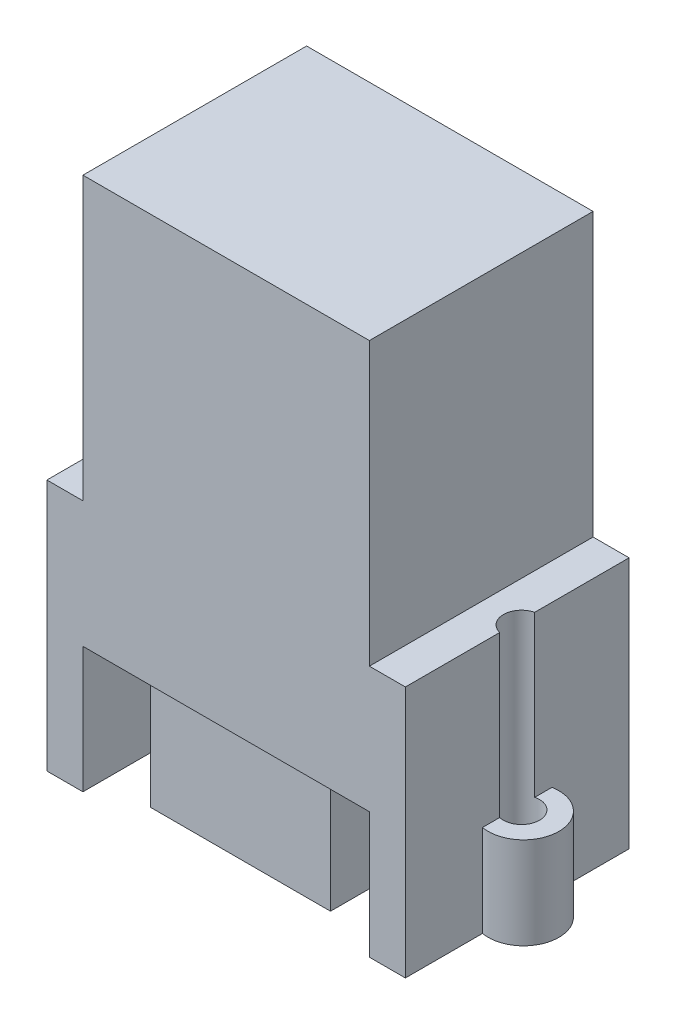
ISO-10303-21;
HEADER;
FILE_DESCRIPTION(('STEP AP214'),'2;1');
FILE_NAME('part.step','',(''),(''),'','','');
FILE_SCHEMA(('AUTOMOTIVE_DESIGN { 1 0 10303 214 1 1 1 1 }'));
ENDSEC;
DATA;
#1=APPLICATION_CONTEXT('core data for automotive mechanical design processes');
#2=APPLICATION_PROTOCOL_DEFINITION('international standard','automotive_design',2000,#1);
#3=PRODUCT_CONTEXT('',#1,'mechanical');
#4=PRODUCT('Part','Part','',(#3));
#5=PRODUCT_RELATED_PRODUCT_CATEGORY('part','',(#4));
#6=PRODUCT_DEFINITION_FORMATION('','',#4);
#7=PRODUCT_DEFINITION_CONTEXT('part definition',#1,'design');
#8=PRODUCT_DEFINITION('design','',#6,#7);
#9=PRODUCT_DEFINITION_SHAPE('','',#8);
#10=(LENGTH_UNIT() NAMED_UNIT(*) SI_UNIT(.MILLI.,.METRE.));
#11=(NAMED_UNIT(*) PLANE_ANGLE_UNIT() SI_UNIT($,.RADIAN.));
#12=(NAMED_UNIT(*) SI_UNIT($,.STERADIAN.) SOLID_ANGLE_UNIT());
#13=UNCERTAINTY_MEASURE_WITH_UNIT(LENGTH_MEASURE(1.E-05),#10,'distance_accuracy_value','');
#14=(GEOMETRIC_REPRESENTATION_CONTEXT(3) GLOBAL_UNCERTAINTY_ASSIGNED_CONTEXT((#13)) GLOBAL_UNIT_ASSIGNED_CONTEXT((#10,
#11,#12)) REPRESENTATION_CONTEXT('',''));
#15=CARTESIAN_POINT('',(0.,0.,0.));
#16=DIRECTION('',(0.,0.,1.));
#17=DIRECTION('',(1.,0.,0.));
#18=AXIS2_PLACEMENT_3D('',#15,#16,#17);
#19=CARTESIAN_POINT('',(14.935,0.,0.));
#20=DIRECTION('',(1.,0.,0.));
#21=DIRECTION('',(0.,0.,1.));
#22=AXIS2_PLACEMENT_3D('',#19,#20,#21);
#23=PLANE('',#22);
#24=DIRECTION('',(0.,0.,-1.));
#25=VECTOR('',#24,1.);
#26=CARTESIAN_POINT('',(14.935,-2.85126793820283,0.));
#27=LINE('',#26,#25);
#28=CARTESIAN_POINT('',(14.935,-2.85126793820283,2.89448350417906));
#29=VERTEX_POINT('',#28);
#30=CARTESIAN_POINT('',(14.935,-2.85126793820283,1.45738635920609));
#31=VERTEX_POINT('',#30);
#32=EDGE_CURVE('E261',#29,#31,#27,.T.);
#33=ORIENTED_EDGE('',*,*,#32,.T.);
#34=DIRECTION('',(0.,-1.,0.));
#35=VECTOR('',#34,1.);
#36=CARTESIAN_POINT('',(14.935,34.,1.45738635920609));
#37=LINE('',#36,#35);
#38=CARTESIAN_POINT('',(14.935,10.5012679382028,1.45738635920609));
#39=VERTEX_POINT('',#38);
#40=EDGE_CURVE('E48',#31,#39,#37,.F.);
#41=ORIENTED_EDGE('',*,*,#40,.T.);
#42=DIRECTION('',(0.,0.,-1.));
#43=VECTOR('',#42,1.);
#44=CARTESIAN_POINT('',(14.935,10.5012679382028,-9.32));
#45=LINE('',#44,#43);
#46=CARTESIAN_POINT('',(14.935,10.5012679382028,9.32));
#47=VERTEX_POINT('',#46);
#48=EDGE_CURVE('E287',#47,#39,#45,.T.);
#49=ORIENTED_EDGE('',*,*,#48,.F.);
#50=DIRECTION('',(0.,1.,0.));
#51=VECTOR('',#50,1.);
#52=CARTESIAN_POINT('',(14.935,10.5012679382028,9.32));
#53=LINE('',#52,#51);
#54=CARTESIAN_POINT('',(14.935,-10.5012679382028,9.32));
#55=VERTEX_POINT('',#54);
#56=EDGE_CURVE('E276',#55,#47,#53,.T.);
#57=ORIENTED_EDGE('',*,*,#56,.F.);
#58=DIRECTION('',(0.,0.,1.));
#59=VECTOR('',#58,1.);
#60=CARTESIAN_POINT('',(14.935,-10.5012679382028,-9.32));
#61=LINE('',#60,#59);
#62=CARTESIAN_POINT('',(14.935,-10.5012679382028,2.89448350417906));
#63=VERTEX_POINT('',#62);
#64=EDGE_CURVE('E279',#63,#55,#61,.T.);
#65=ORIENTED_EDGE('',*,*,#64,.F.);
#66=DIRECTION('',(0.,-1.,0.));
#67=VECTOR('',#66,1.);
#68=CARTESIAN_POINT('',(14.935,-2.85126793820283,2.89448350417906));
#69=LINE('',#68,#67);
#70=EDGE_CURVE('E271',#29,#63,#69,.T.);
#71=ORIENTED_EDGE('',*,*,#70,.F.);
#72=EDGE_LOOP('',(#33,#41,#49,#57,#65,#71));
#73=FACE_BOUND('',#72,.T.);
#74=ADVANCED_FACE('F34',(#73),#23,.T.);
#75=CARTESIAN_POINT('',(14.935,10.5012679382028,-1.45738635920609));
#76=VERTEX_POINT('',#75);
#77=CARTESIAN_POINT('',(14.935,10.5012679382028,-9.32));
#78=VERTEX_POINT('',#77);
#79=EDGE_CURVE('E255',#76,#78,#45,.T.);
#80=ORIENTED_EDGE('',*,*,#79,.F.);
#81=DIRECTION('',(0.,-1.,0.));
#82=VECTOR('',#81,1.);
#83=CARTESIAN_POINT('',(14.935,34.,-1.45738635920609));
#84=LINE('',#83,#82);
#85=CARTESIAN_POINT('',(14.935,-2.85126793820283,-1.45738635920609));
#86=VERTEX_POINT('',#85);
#87=EDGE_CURVE('E242',#76,#86,#84,.T.);
#88=ORIENTED_EDGE('',*,*,#87,.T.);
#89=CARTESIAN_POINT('',(14.935,-2.85126793820283,-2.89448350417906));
#90=VERTEX_POINT('',#89);
#91=EDGE_CURVE('E252',#86,#90,#27,.T.);
#92=ORIENTED_EDGE('',*,*,#91,.T.);
#93=DIRECTION('',(0.,-1.,0.));
#94=VECTOR('',#93,1.);
#95=CARTESIAN_POINT('',(14.935,-2.85126793820283,-2.89448350417906));
#96=LINE('',#95,#94);
#97=CARTESIAN_POINT('',(14.935,-10.5012679382028,-2.89448350417906));
#98=VERTEX_POINT('',#97);
#99=EDGE_CURVE('E269',#90,#98,#96,.T.);
#100=ORIENTED_EDGE('',*,*,#99,.T.);
#101=CARTESIAN_POINT('',(14.935,-10.5012679382028,-9.32));
#102=VERTEX_POINT('',#101);
#103=EDGE_CURVE('E281',#102,#98,#61,.T.);
#104=ORIENTED_EDGE('',*,*,#103,.F.);
#105=DIRECTION('',(0.,-1.,0.));
#106=VECTOR('',#105,1.);
#107=CARTESIAN_POINT('',(14.935,10.5012679382028,-9.32));
#108=LINE('',#107,#106);
#109=EDGE_CURVE('E284',#78,#102,#108,.T.);
#110=ORIENTED_EDGE('',*,*,#109,.F.);
#111=EDGE_LOOP('',(#80,#88,#92,#100,#104,#110));
#112=FACE_BOUND('',#111,.T.);
#113=ADVANCED_FACE('F250',(#112),#23,.T.);
#114=CARTESIAN_POINT('',(-14.935,0.,0.));
#115=DIRECTION('',(-1.,0.,0.));
#116=DIRECTION('',(0.,0.,1.));
#117=AXIS2_PLACEMENT_3D('',#114,#115,#116);
#118=PLANE('',#117);
#119=DIRECTION('',(0.,-1.,0.));
#120=VECTOR('',#119,1.);
#121=CARTESIAN_POINT('',(-14.935,34.,-1.45738635920609));
#122=LINE('',#121,#120);
#123=CARTESIAN_POINT('',(-14.935,10.5012679382028,-1.45738635920609));
#124=VERTEX_POINT('',#123);
#125=CARTESIAN_POINT('',(-14.935,-2.85126793820283,-1.45738635920609));
#126=VERTEX_POINT('',#125);
#127=EDGE_CURVE('E56',#124,#126,#122,.T.);
#128=ORIENTED_EDGE('',*,*,#127,.F.);
#129=DIRECTION('',(0.,0.,-1.));
#130=VECTOR('',#129,1.);
#131=CARTESIAN_POINT('',(-14.935,10.5012679382028,-9.32));
#132=LINE('',#131,#130);
#133=CARTESIAN_POINT('',(-14.935,10.5012679382028,-9.32));
#134=VERTEX_POINT('',#133);
#135=EDGE_CURVE('E327',#124,#134,#132,.T.);
#136=ORIENTED_EDGE('',*,*,#135,.T.);
#137=DIRECTION('',(0.,-1.,0.));
#138=VECTOR('',#137,1.);
#139=CARTESIAN_POINT('',(-14.935,10.5012679382028,-9.32));
#140=LINE('',#139,#138);
#141=CARTESIAN_POINT('',(-14.935,-10.5012679382028,-9.32));
#142=VERTEX_POINT('',#141);
#143=EDGE_CURVE('E332',#134,#142,#140,.T.);
#144=ORIENTED_EDGE('',*,*,#143,.T.);
#145=DIRECTION('',(0.,0.,1.));
#146=VECTOR('',#145,1.);
#147=CARTESIAN_POINT('',(-14.935,-10.5012679382028,-9.32));
#148=LINE('',#147,#146);
#149=CARTESIAN_POINT('',(-14.935,-10.5012679382028,-2.89448350417906));
#150=VERTEX_POINT('',#149);
#151=EDGE_CURVE('E335',#142,#150,#148,.T.);
#152=ORIENTED_EDGE('',*,*,#151,.T.);
#153=DIRECTION('',(0.,-1.,0.));
#154=VECTOR('',#153,1.);
#155=CARTESIAN_POINT('',(-14.935,-2.85126793820283,-2.89448350417906));
#156=LINE('',#155,#154);
#157=CARTESIAN_POINT('',(-14.935,-2.85126793820283,-2.89448350417906));
#158=VERTEX_POINT('',#157);
#159=EDGE_CURVE('E318',#158,#150,#156,.T.);
#160=ORIENTED_EDGE('',*,*,#159,.F.);
#161=DIRECTION('',(0.,0.,-1.));
#162=VECTOR('',#161,1.);
#163=CARTESIAN_POINT('',(-14.935,-2.85126793820283,0.));
#164=LINE('',#163,#162);
#165=EDGE_CURVE('E312',#126,#158,#164,.T.);
#166=ORIENTED_EDGE('',*,*,#165,.F.);
#167=EDGE_LOOP('',(#128,#136,#144,#152,#160,#166));
#168=FACE_BOUND('',#167,.T.);
#169=ADVANCED_FACE('F498',(#168),#118,.T.);
#170=CARTESIAN_POINT('',(-11.935,34.,9.32));
#171=DIRECTION('',(1.,0.,0.));
#172=DIRECTION('',(0.,0.,-1.));
#173=AXIS2_PLACEMENT_3D('',#170,#171,#172);
#174=PLANE('',#173);
#175=DIRECTION('',(0.,0.,-1.));
#176=VECTOR('',#175,1.);
#177=CARTESIAN_POINT('',(-11.935,10.5012679382028,-9.32));
#178=LINE('',#177,#176);
#179=CARTESIAN_POINT('',(-11.935,10.5012679382028,9.32));
#180=VERTEX_POINT('',#179);
#181=CARTESIAN_POINT('',(-11.935,10.5012679382028,-9.32));
#182=VERTEX_POINT('',#181);
#183=EDGE_CURVE('E340',#180,#182,#178,.T.);
#184=ORIENTED_EDGE('',*,*,#183,.F.);
#185=DIRECTION('',(0.,-1.,0.));
#186=VECTOR('',#185,1.);
#187=CARTESIAN_POINT('',(-11.935,34.,9.32));
#188=LINE('',#187,#186);
#189=CARTESIAN_POINT('',(-11.935,34.,9.32));
#190=VERTEX_POINT('',#189);
#191=EDGE_CURVE('E379',#190,#180,#188,.T.);
#192=ORIENTED_EDGE('',*,*,#191,.F.);
#193=DIRECTION('',(0.,0.,1.));
#194=VECTOR('',#193,1.);
#195=CARTESIAN_POINT('',(-11.935,34.,9.32));
#196=LINE('',#195,#194);
#197=CARTESIAN_POINT('',(-11.935,34.,-9.32));
#198=VERTEX_POINT('',#197);
#199=EDGE_CURVE('E364',#198,#190,#196,.T.);
#200=ORIENTED_EDGE('',*,*,#199,.F.);
#201=DIRECTION('',(0.,-1.,0.));
#202=VECTOR('',#201,1.);
#203=CARTESIAN_POINT('',(-11.935,34.,-9.32));
#204=LINE('',#203,#202);
#205=EDGE_CURVE('E382',#198,#182,#204,.T.);
#206=ORIENTED_EDGE('',*,*,#205,.T.);
#207=EDGE_LOOP('',(#184,#192,#200,#206));
#208=FACE_BOUND('',#207,.T.);
#209=ADVANCED_FACE('F585',(#208),#174,.F.);
#210=CARTESIAN_POINT('',(7.5,-10.,8.125));
#211=DIRECTION('',(1.,0.,0.));
#212=DIRECTION('',(0.,0.,-1.));
#213=AXIS2_PLACEMENT_3D('',#210,#211,#212);
#214=PLANE('',#213);
#215=DIRECTION('',(0.,0.,-1.));
#216=VECTOR('',#215,1.);
#217=CARTESIAN_POINT('',(7.5,0.,8.125));
#218=LINE('',#217,#216);
#219=CARTESIAN_POINT('',(7.5,0.,8.125));
#220=VERTEX_POINT('',#219);
#221=CARTESIAN_POINT('',(7.5,0.,-8.125));
#222=VERTEX_POINT('',#221);
#223=EDGE_CURVE('E417',#220,#222,#218,.T.);
#224=ORIENTED_EDGE('',*,*,#223,.F.);
#225=DIRECTION('',(0.,1.,0.));
#226=VECTOR('',#225,1.);
#227=CARTESIAN_POINT('',(7.5,-10.,8.125));
#228=LINE('',#227,#226);
#229=CARTESIAN_POINT('',(7.5,-10.,8.125));
#230=VERTEX_POINT('',#229);
#231=EDGE_CURVE('E484',#230,#220,#228,.T.);
#232=ORIENTED_EDGE('',*,*,#231,.F.);
#233=DIRECTION('',(0.,0.,-1.));
#234=VECTOR('',#233,1.);
#235=CARTESIAN_POINT('',(7.5,-10.,8.125));
#236=LINE('',#235,#234);
#237=CARTESIAN_POINT('',(7.5,-10.,-8.125));
#238=VERTEX_POINT('',#237);
#239=EDGE_CURVE('E460',#230,#238,#236,.T.);
#240=ORIENTED_EDGE('',*,*,#239,.T.);
#241=DIRECTION('',(0.,1.,0.));
#242=VECTOR('',#241,1.);
#243=CARTESIAN_POINT('',(7.5,-10.,-8.125));
#244=LINE('',#243,#242);
#245=EDGE_CURVE('E473',#238,#222,#244,.T.);
#246=ORIENTED_EDGE('',*,*,#245,.T.);
#247=EDGE_LOOP('',(#224,#232,#240,#246));
#248=FACE_BOUND('',#247,.T.);
#249=ADVANCED_FACE('F36',(#248),#214,.T.);
#250=CARTESIAN_POINT('',(-7.5,-10.,8.125));
#251=DIRECTION('',(0.,0.,1.));
#252=DIRECTION('',(1.,0.,0.));
#253=AXIS2_PLACEMENT_3D('',#250,#251,#252);
#254=PLANE('',#253);
#255=DIRECTION('',(1.,0.,0.));
#256=VECTOR('',#255,1.);
#257=CARTESIAN_POINT('',(-7.5,0.,8.125));
#258=LINE('',#257,#256);
#259=CARTESIAN_POINT('',(-7.5,0.,8.125));
#260=VERTEX_POINT('',#259);
#261=EDGE_CURVE('E464',#260,#220,#258,.T.);
#262=ORIENTED_EDGE('',*,*,#261,.F.);
#263=DIRECTION('',(0.,1.,0.));
#264=VECTOR('',#263,1.);
#265=CARTESIAN_POINT('',(-7.5,-10.,8.125));
#266=LINE('',#265,#264);
#267=CARTESIAN_POINT('',(-7.5,-10.,8.125));
#268=VERTEX_POINT('',#267);
#269=EDGE_CURVE('E487',#268,#260,#266,.T.);
#270=ORIENTED_EDGE('',*,*,#269,.F.);
#271=DIRECTION('',(1.,0.,0.));
#272=VECTOR('',#271,1.);
#273=CARTESIAN_POINT('',(-7.5,-10.,8.125));
#274=LINE('',#273,#272);
#275=EDGE_CURVE('E470',#268,#230,#274,.T.);
#276=ORIENTED_EDGE('',*,*,#275,.T.);
#277=ORIENTED_EDGE('',*,*,#231,.T.);
#278=EDGE_LOOP('',(#262,#270,#276,#277));
#279=FACE_BOUND('',#278,.T.);
#280=ADVANCED_FACE('F632',(#279),#254,.T.);
#281=CARTESIAN_POINT('',(-7.5,-10.,8.125));
#282=DIRECTION('',(-1.,0.,0.));
#283=DIRECTION('',(0.,0.,1.));
#284=AXIS2_PLACEMENT_3D('',#281,#282,#283);
#285=PLANE('',#284);
#286=DIRECTION('',(0.,0.,1.));
#287=VECTOR('',#286,1.);
#288=CARTESIAN_POINT('',(-7.5,0.,8.125));
#289=LINE('',#288,#287);
#290=CARTESIAN_POINT('',(-7.5,0.,-8.125));
#291=VERTEX_POINT('',#290);
#292=EDGE_CURVE('E479',#291,#260,#289,.T.);
#293=ORIENTED_EDGE('',*,*,#292,.F.);
#294=DIRECTION('',(0.,1.,0.));
#295=VECTOR('',#294,1.);
#296=CARTESIAN_POINT('',(-7.5,-10.,-8.125));
#297=LINE('',#296,#295);
#298=CARTESIAN_POINT('',(-7.5,-10.,-8.125));
#299=VERTEX_POINT('',#298);
#300=EDGE_CURVE('E489',#299,#291,#297,.T.);
#301=ORIENTED_EDGE('',*,*,#300,.F.);
#302=DIRECTION('',(0.,0.,1.));
#303=VECTOR('',#302,1.);
#304=CARTESIAN_POINT('',(-7.5,-10.,8.125));
#305=LINE('',#304,#303);
#306=EDGE_CURVE('E467',#299,#268,#305,.T.);
#307=ORIENTED_EDGE('',*,*,#306,.T.);
#308=ORIENTED_EDGE('',*,*,#269,.T.);
#309=EDGE_LOOP('',(#293,#301,#307,#308));
#310=FACE_BOUND('',#309,.T.);
#311=ADVANCED_FACE('F635',(#310),#285,.T.);
#312=CARTESIAN_POINT('',(-7.5,-10.,-8.125));
#313=DIRECTION('',(0.,0.,-1.));
#314=DIRECTION('',(-1.,0.,0.));
#315=AXIS2_PLACEMENT_3D('',#312,#313,#314);
#316=PLANE('',#315);
#317=DIRECTION('',(-1.,0.,0.));
#318=VECTOR('',#317,1.);
#319=CARTESIAN_POINT('',(-7.5,0.,-8.125));
#320=LINE('',#319,#318);
#321=EDGE_CURVE('E476',#222,#291,#320,.T.);
#322=ORIENTED_EDGE('',*,*,#321,.F.);
#323=ORIENTED_EDGE('',*,*,#245,.F.);
#324=DIRECTION('',(-1.,0.,0.));
#325=VECTOR('',#324,1.);
#326=CARTESIAN_POINT('',(-7.5,-10.,-8.125));
#327=LINE('',#326,#325);
#328=EDGE_CURVE('E463',#238,#299,#327,.T.);
#329=ORIENTED_EDGE('',*,*,#328,.T.);
#330=ORIENTED_EDGE('',*,*,#300,.T.);
#331=EDGE_LOOP('',(#322,#323,#329,#330));
#332=FACE_BOUND('',#331,.T.);
#333=ADVANCED_FACE('F630',(#332),#316,.T.);
#334=CARTESIAN_POINT('',(0.,-10.,0.));
#335=DIRECTION('',(0.,-1.,0.));
#336=DIRECTION('',(0.,0.,-1.));
#337=AXIS2_PLACEMENT_3D('',#334,#335,#336);
#338=PLANE('',#337);
#339=DIRECTION('',(0.,0.,-1.));
#340=VECTOR('',#339,1.);
#341=CARTESIAN_POINT('',(5.58558044896174,-10.,-3.6946575025496));
#342=LINE('',#341,#340);
#343=CARTESIAN_POINT('',(5.58558044896174,-10.,-3.6946575025496));
#344=VERTEX_POINT('',#343);
#345=CARTESIAN_POINT('',(5.58558044896174,-10.,-7.10244499300927));
#346=VERTEX_POINT('',#345);
#347=EDGE_CURVE('E388',#344,#346,#342,.T.);
#348=ORIENTED_EDGE('',*,*,#347,.T.);
#349=DIRECTION('',(-1.,0.,0.));
#350=VECTOR('',#349,1.);
#351=CARTESIAN_POINT('',(-5.58558044896174,-10.,-7.10244499300927));
#352=LINE('',#351,#350);
#353=CARTESIAN_POINT('',(-5.58558044896174,-10.,-7.10244499300927));
#354=VERTEX_POINT('',#353);
#355=EDGE_CURVE('E391',#346,#354,#352,.T.);
#356=ORIENTED_EDGE('',*,*,#355,.T.);
#357=DIRECTION('',(0.,0.,1.));
#358=VECTOR('',#357,1.);
#359=CARTESIAN_POINT('',(-5.58558044896174,-10.,-3.6946575025496));
#360=LINE('',#359,#358);
#361=CARTESIAN_POINT('',(-5.58558044896174,-10.,-3.6946575025496));
#362=VERTEX_POINT('',#361);
#363=EDGE_CURVE('E395',#354,#362,#360,.T.);
#364=ORIENTED_EDGE('',*,*,#363,.T.);
#365=DIRECTION('',(1.,0.,0.));
#366=VECTOR('',#365,1.);
#367=CARTESIAN_POINT('',(-5.58558044896174,-10.,-3.6946575025496));
#368=LINE('',#367,#366);
#369=EDGE_CURVE('E398',#362,#344,#368,.T.);
#370=ORIENTED_EDGE('',*,*,#369,.T.);
#371=EDGE_LOOP('',(#348,#356,#364,#370));
#372=FACE_BOUND('',#371,.T.);
#373=DIRECTION('',(0.,0.,-1.));
#374=VECTOR('',#373,1.);
#375=CARTESIAN_POINT('',(5.58558044896174,-10.,5.28661924555252));
#376=LINE('',#375,#374);
#377=CARTESIAN_POINT('',(5.58558044896174,-10.,5.28661924555252));
#378=VERTEX_POINT('',#377);
#379=CARTESIAN_POINT('',(5.58558044896174,-10.,1.89696441562148));
#380=VERTEX_POINT('',#379);
#381=EDGE_CURVE('E426',#378,#380,#376,.T.);
#382=ORIENTED_EDGE('',*,*,#381,.T.);
#383=DIRECTION('',(-1.,0.,0.));
#384=VECTOR('',#383,1.);
#385=CARTESIAN_POINT('',(-5.58558044896174,-10.,1.89696441562148));
#386=LINE('',#385,#384);
#387=CARTESIAN_POINT('',(-5.58558044896174,-10.,1.89696441562148));
#388=VERTEX_POINT('',#387);
#389=EDGE_CURVE('E429',#380,#388,#386,.T.);
#390=ORIENTED_EDGE('',*,*,#389,.T.);
#391=DIRECTION('',(0.,0.,1.));
#392=VECTOR('',#391,1.);
#393=CARTESIAN_POINT('',(-5.58558044896174,-10.,5.28661924555252));
#394=LINE('',#393,#392);
#395=CARTESIAN_POINT('',(-5.58558044896174,-10.,5.28661924555252));
#396=VERTEX_POINT('',#395);
#397=EDGE_CURVE('E433',#388,#396,#394,.T.);
#398=ORIENTED_EDGE('',*,*,#397,.T.);
#399=DIRECTION('',(1.,0.,0.));
#400=VECTOR('',#399,1.);
#401=CARTESIAN_POINT('',(-5.58558044896174,-10.,5.28661924555252));
#402=LINE('',#401,#400);
#403=EDGE_CURVE('E436',#396,#378,#402,.T.);
#404=ORIENTED_EDGE('',*,*,#403,.T.);
#405=EDGE_LOOP('',(#382,#390,#398,#404));
#406=FACE_BOUND('',#405,.T.);
#407=ORIENTED_EDGE('',*,*,#239,.F.);
#408=ORIENTED_EDGE('',*,*,#275,.F.);
#409=ORIENTED_EDGE('',*,*,#306,.F.);
#410=ORIENTED_EDGE('',*,*,#328,.F.);
#411=EDGE_LOOP('',(#407,#408,#409,#410));
#412=FACE_BOUND('',#411,.T.);
#413=ADVANCED_FACE('F626',(#372,#406,#412),#338,.T.);
#414=CARTESIAN_POINT('',(5.58558044896174,-10.,5.28661924555252));
#415=DIRECTION('',(1.,0.,0.));
#416=DIRECTION('',(0.,0.,-1.));
#417=AXIS2_PLACEMENT_3D('',#414,#415,#416);
#418=PLANE('',#417);
#419=DIRECTION('',(0.,0.,-1.));
#420=VECTOR('',#419,1.);
#421=CARTESIAN_POINT('',(5.58558044896174,0.,5.28661924555252));
#422=LINE('',#421,#420);
#423=CARTESIAN_POINT('',(5.58558044896174,0.,5.28661924555252));
#424=VERTEX_POINT('',#423);
#425=CARTESIAN_POINT('',(5.58558044896174,0.,1.89696441562148));
#426=VERTEX_POINT('',#425);
#427=EDGE_CURVE('E387',#424,#426,#422,.T.);
#428=ORIENTED_EDGE('',*,*,#427,.T.);
#429=DIRECTION('',(0.,1.,0.));
#430=VECTOR('',#429,1.);
#431=CARTESIAN_POINT('',(5.58558044896174,-10.,1.89696441562148));
#432=LINE('',#431,#430);
#433=EDGE_CURVE('E439',#380,#426,#432,.T.);
#434=ORIENTED_EDGE('',*,*,#433,.F.);
#435=ORIENTED_EDGE('',*,*,#381,.F.);
#436=DIRECTION('',(0.,1.,0.));
#437=VECTOR('',#436,1.);
#438=CARTESIAN_POINT('',(5.58558044896174,-10.,5.28661924555252));
#439=LINE('',#438,#437);
#440=EDGE_CURVE('E406',#378,#424,#439,.T.);
#441=ORIENTED_EDGE('',*,*,#440,.T.);
#442=EDGE_LOOP('',(#428,#434,#435,#441));
#443=FACE_BOUND('',#442,.T.);
#444=ADVANCED_FACE('F616',(#443),#418,.F.);
#445=CARTESIAN_POINT('',(-5.58558044896174,-10.,5.28661924555252));
#446=DIRECTION('',(0.,0.,1.));
#447=DIRECTION('',(1.,0.,0.));
#448=AXIS2_PLACEMENT_3D('',#445,#446,#447);
#449=PLANE('',#448);
#450=DIRECTION('',(1.,0.,0.));
#451=VECTOR('',#450,1.);
#452=CARTESIAN_POINT('',(-5.58558044896174,0.,5.28661924555252));
#453=LINE('',#452,#451);
#454=CARTESIAN_POINT('',(-5.58558044896174,0.,5.28661924555252));
#455=VERTEX_POINT('',#454);
#456=EDGE_CURVE('E430',#455,#424,#453,.T.);
#457=ORIENTED_EDGE('',*,*,#456,.T.);
#458=ORIENTED_EDGE('',*,*,#440,.F.);
#459=ORIENTED_EDGE('',*,*,#403,.F.);
#460=DIRECTION('',(0.,1.,0.));
#461=VECTOR('',#460,1.);
#462=CARTESIAN_POINT('',(-5.58558044896174,-10.,5.28661924555252));
#463=LINE('',#462,#461);
#464=EDGE_CURVE('E452',#396,#455,#463,.T.);
#465=ORIENTED_EDGE('',*,*,#464,.T.);
#466=EDGE_LOOP('',(#457,#458,#459,#465));
#467=FACE_BOUND('',#466,.T.);
#468=ADVANCED_FACE('F612',(#467),#449,.F.);
#469=CARTESIAN_POINT('',(-5.58558044896174,-10.,5.28661924555252));
#470=DIRECTION('',(-1.,0.,0.));
#471=DIRECTION('',(0.,0.,1.));
#472=AXIS2_PLACEMENT_3D('',#469,#470,#471);
#473=PLANE('',#472);
#474=DIRECTION('',(0.,0.,1.));
#475=VECTOR('',#474,1.);
#476=CARTESIAN_POINT('',(-5.58558044896174,0.,5.28661924555252));
#477=LINE('',#476,#475);
#478=CARTESIAN_POINT('',(-5.58558044896174,0.,1.89696441562148));
#479=VERTEX_POINT('',#478);
#480=EDGE_CURVE('E445',#479,#455,#477,.T.);
#481=ORIENTED_EDGE('',*,*,#480,.T.);
#482=ORIENTED_EDGE('',*,*,#464,.F.);
#483=ORIENTED_EDGE('',*,*,#397,.F.);
#484=DIRECTION('',(0.,1.,0.));
#485=VECTOR('',#484,1.);
#486=CARTESIAN_POINT('',(-5.58558044896174,-10.,1.89696441562148));
#487=LINE('',#486,#485);
#488=EDGE_CURVE('E455',#388,#479,#487,.T.);
#489=ORIENTED_EDGE('',*,*,#488,.T.);
#490=EDGE_LOOP('',(#481,#482,#483,#489));
#491=FACE_BOUND('',#490,.T.);
#492=ADVANCED_FACE('F615',(#491),#473,.F.);
#493=CARTESIAN_POINT('',(-5.58558044896174,-10.,1.89696441562148));
#494=DIRECTION('',(0.,0.,-1.));
#495=DIRECTION('',(-1.,0.,0.));
#496=AXIS2_PLACEMENT_3D('',#493,#494,#495);
#497=PLANE('',#496);
#498=DIRECTION('',(-1.,0.,0.));
#499=VECTOR('',#498,1.);
#500=CARTESIAN_POINT('',(-5.58558044896174,0.,1.89696441562148));
#501=LINE('',#500,#499);
#502=EDGE_CURVE('E442',#426,#479,#501,.T.);
#503=ORIENTED_EDGE('',*,*,#502,.T.);
#504=ORIENTED_EDGE('',*,*,#488,.F.);
#505=ORIENTED_EDGE('',*,*,#389,.F.);
#506=ORIENTED_EDGE('',*,*,#433,.T.);
#507=EDGE_LOOP('',(#503,#504,#505,#506));
#508=FACE_BOUND('',#507,.T.);
#509=ADVANCED_FACE('F610',(#508),#497,.F.);
#510=CARTESIAN_POINT('',(5.58558044896174,-10.,-3.6946575025496));
#511=DIRECTION('',(1.,0.,0.));
#512=DIRECTION('',(0.,0.,-1.));
#513=AXIS2_PLACEMENT_3D('',#510,#511,#512);
#514=PLANE('',#513);
#515=DIRECTION('',(0.,0.,-1.));
#516=VECTOR('',#515,1.);
#517=CARTESIAN_POINT('',(5.58558044896174,0.,-3.6946575025496));
#518=LINE('',#517,#516);
#519=CARTESIAN_POINT('',(5.58558044896174,0.,-3.6946575025496));
#520=VERTEX_POINT('',#519);
#521=CARTESIAN_POINT('',(5.58558044896174,0.,-7.10244499300927));
#522=VERTEX_POINT('',#521);
#523=EDGE_CURVE('E402',#520,#522,#518,.T.);
#524=ORIENTED_EDGE('',*,*,#523,.T.);
#525=DIRECTION('',(0.,1.,0.));
#526=VECTOR('',#525,1.);
#527=CARTESIAN_POINT('',(5.58558044896174,-10.,-7.10244499300927));
#528=LINE('',#527,#526);
#529=EDGE_CURVE('E401',#346,#522,#528,.T.);
#530=ORIENTED_EDGE('',*,*,#529,.F.);
#531=ORIENTED_EDGE('',*,*,#347,.F.);
#532=DIRECTION('',(0.,1.,0.));
#533=VECTOR('',#532,1.);
#534=CARTESIAN_POINT('',(5.58558044896174,-10.,-3.6946575025496));
#535=LINE('',#534,#533);
#536=EDGE_CURVE('E414',#344,#520,#535,.T.);
#537=ORIENTED_EDGE('',*,*,#536,.T.);
#538=EDGE_LOOP('',(#524,#530,#531,#537));
#539=FACE_BOUND('',#538,.T.);
#540=ADVANCED_FACE('F600',(#539),#514,.F.);
#541=CARTESIAN_POINT('',(-5.58558044896174,-10.,-3.6946575025496));
#542=DIRECTION('',(0.,0.,1.));
#543=DIRECTION('',(1.,0.,0.));
#544=AXIS2_PLACEMENT_3D('',#541,#542,#543);
#545=PLANE('',#544);
#546=DIRECTION('',(1.,0.,0.));
#547=VECTOR('',#546,1.);
#548=CARTESIAN_POINT('',(-5.58558044896174,0.,-3.6946575025496));
#549=LINE('',#548,#547);
#550=CARTESIAN_POINT('',(-5.58558044896174,0.,-3.6946575025496));
#551=VERTEX_POINT('',#550);
#552=EDGE_CURVE('E392',#551,#520,#549,.T.);
#553=ORIENTED_EDGE('',*,*,#552,.T.);
#554=ORIENTED_EDGE('',*,*,#536,.F.);
#555=ORIENTED_EDGE('',*,*,#369,.F.);
#556=DIRECTION('',(0.,1.,0.));
#557=VECTOR('',#556,1.);
#558=CARTESIAN_POINT('',(-5.58558044896174,-10.,-3.6946575025496));
#559=LINE('',#558,#557);
#560=EDGE_CURVE('E418',#362,#551,#559,.T.);
#561=ORIENTED_EDGE('',*,*,#560,.T.);
#562=EDGE_LOOP('',(#553,#554,#555,#561));
#563=FACE_BOUND('',#562,.T.);
#564=ADVANCED_FACE('F596',(#563),#545,.F.);
#565=CARTESIAN_POINT('',(-5.58558044896174,-10.,-3.6946575025496));
#566=DIRECTION('',(-1.,0.,0.));
#567=DIRECTION('',(0.,0.,1.));
#568=AXIS2_PLACEMENT_3D('',#565,#566,#567);
#569=PLANE('',#568);
#570=DIRECTION('',(0.,0.,1.));
#571=VECTOR('',#570,1.);
#572=CARTESIAN_POINT('',(-5.58558044896174,0.,-3.6946575025496));
#573=LINE('',#572,#571);
#574=CARTESIAN_POINT('',(-5.58558044896174,0.,-7.10244499300927));
#575=VERTEX_POINT('',#574);
#576=EDGE_CURVE('E409',#575,#551,#573,.T.);
#577=ORIENTED_EDGE('',*,*,#576,.T.);
#578=ORIENTED_EDGE('',*,*,#560,.F.);
#579=ORIENTED_EDGE('',*,*,#363,.F.);
#580=DIRECTION('',(0.,1.,0.));
#581=VECTOR('',#580,1.);
#582=CARTESIAN_POINT('',(-5.58558044896174,-10.,-7.10244499300927));
#583=LINE('',#582,#581);
#584=EDGE_CURVE('E421',#354,#575,#583,.T.);
#585=ORIENTED_EDGE('',*,*,#584,.T.);
#586=EDGE_LOOP('',(#577,#578,#579,#585));
#587=FACE_BOUND('',#586,.T.);
#588=ADVANCED_FACE('F599',(#587),#569,.F.);
#589=CARTESIAN_POINT('',(-5.58558044896174,-10.,-7.10244499300927));
#590=DIRECTION('',(0.,0.,-1.));
#591=DIRECTION('',(-1.,0.,0.));
#592=AXIS2_PLACEMENT_3D('',#589,#590,#591);
#593=PLANE('',#592);
#594=DIRECTION('',(-1.,0.,0.));
#595=VECTOR('',#594,1.);
#596=CARTESIAN_POINT('',(-5.58558044896174,0.,-7.10244499300927));
#597=LINE('',#596,#595);
#598=EDGE_CURVE('E405',#522,#575,#597,.T.);
#599=ORIENTED_EDGE('',*,*,#598,.T.);
#600=ORIENTED_EDGE('',*,*,#584,.F.);
#601=ORIENTED_EDGE('',*,*,#355,.F.);
#602=ORIENTED_EDGE('',*,*,#529,.T.);
#603=EDGE_LOOP('',(#599,#600,#601,#602));
#604=FACE_BOUND('',#603,.T.);
#605=ADVANCED_FACE('F578',(#604),#593,.F.);
#606=CARTESIAN_POINT('',(0.,0.,0.));
#607=DIRECTION('',(0.,-1.,0.));
#608=DIRECTION('',(0.,0.,-1.));
#609=AXIS2_PLACEMENT_3D('',#606,#607,#608);
#610=PLANE('',#609);
#611=ORIENTED_EDGE('',*,*,#261,.T.);
#612=ORIENTED_EDGE('',*,*,#223,.T.);
#613=ORIENTED_EDGE('',*,*,#321,.T.);
#614=ORIENTED_EDGE('',*,*,#292,.T.);
#615=EDGE_LOOP('',(#611,#612,#613,#614));
#616=FACE_BOUND('',#615,.T.);
#617=DIRECTION('',(0.,0.,-1.));
#618=VECTOR('',#617,1.);
#619=CARTESIAN_POINT('',(11.935,0.,9.32));
#620=LINE('',#619,#618);
#621=CARTESIAN_POINT('',(11.935,0.,9.32));
#622=VERTEX_POINT('',#621);
#623=CARTESIAN_POINT('',(11.935,0.,-9.32));
#624=VERTEX_POINT('',#623);
#625=EDGE_CURVE('E357',#622,#624,#620,.T.);
#626=ORIENTED_EDGE('',*,*,#625,.F.);
#627=DIRECTION('',(1.,0.,0.));
#628=VECTOR('',#627,1.);
#629=CARTESIAN_POINT('',(-11.935,0.,9.32));
#630=LINE('',#629,#628);
#631=CARTESIAN_POINT('',(-11.935,0.,9.32));
#632=VERTEX_POINT('',#631);
#633=EDGE_CURVE('E362',#632,#622,#630,.T.);
#634=ORIENTED_EDGE('',*,*,#633,.F.);
#635=DIRECTION('',(0.,0.,1.));
#636=VECTOR('',#635,1.);
#637=CARTESIAN_POINT('',(-11.935,0.,9.32));
#638=LINE('',#637,#636);
#639=CARTESIAN_POINT('',(-11.935,0.,-9.32));
#640=VERTEX_POINT('',#639);
#641=EDGE_CURVE('E372',#640,#632,#638,.T.);
#642=ORIENTED_EDGE('',*,*,#641,.F.);
#643=DIRECTION('',(-1.,0.,0.));
#644=VECTOR('',#643,1.);
#645=CARTESIAN_POINT('',(-11.935,0.,-9.32));
#646=LINE('',#645,#644);
#647=EDGE_CURVE('E370',#624,#640,#646,.T.);
#648=ORIENTED_EDGE('',*,*,#647,.F.);
#649=EDGE_LOOP('',(#626,#634,#642,#648));
#650=FACE_BOUND('',#649,.T.);
#651=ADVANCED_FACE('F574',(#616,#650),#610,.T.);
#652=CARTESIAN_POINT('',(0.,34.,0.));
#653=DIRECTION('',(0.,-1.,0.));
#654=DIRECTION('',(0.,0.,-1.));
#655=AXIS2_PLACEMENT_3D('',#652,#653,#654);
#656=PLANE('',#655);
#657=DIRECTION('',(0.,0.,-1.));
#658=VECTOR('',#657,1.);
#659=CARTESIAN_POINT('',(11.935,34.,9.32));
#660=LINE('',#659,#658);
#661=CARTESIAN_POINT('',(11.935,34.,9.32));
#662=VERTEX_POINT('',#661);
#663=CARTESIAN_POINT('',(11.935,34.,-9.32));
#664=VERTEX_POINT('',#663);
#665=EDGE_CURVE('E358',#662,#664,#660,.T.);
#666=ORIENTED_EDGE('',*,*,#665,.T.);
#667=DIRECTION('',(-1.,0.,0.));
#668=VECTOR('',#667,1.);
#669=CARTESIAN_POINT('',(-11.935,34.,-9.32));
#670=LINE('',#669,#668);
#671=EDGE_CURVE('E361',#664,#198,#670,.T.);
#672=ORIENTED_EDGE('',*,*,#671,.T.);
#673=ORIENTED_EDGE('',*,*,#199,.T.);
#674=DIRECTION('',(1.,0.,0.));
#675=VECTOR('',#674,1.);
#676=CARTESIAN_POINT('',(-11.935,34.,9.32));
#677=LINE('',#676,#675);
#678=EDGE_CURVE('E366',#190,#662,#677,.T.);
#679=ORIENTED_EDGE('',*,*,#678,.T.);
#680=EDGE_LOOP('',(#666,#672,#673,#679));
#681=FACE_BOUND('',#680,.T.);
#682=ADVANCED_FACE('F570',(#681),#656,.F.);
#683=CARTESIAN_POINT('',(-11.935,34.,9.32));
#684=DIRECTION('',(0.,0.,-1.));
#685=DIRECTION('',(-1.,0.,0.));
#686=AXIS2_PLACEMENT_3D('',#683,#684,#685);
#687=PLANE('',#686);
#688=ORIENTED_EDGE('',*,*,#633,.T.);
#689=DIRECTION('',(0.,1.,0.));
#690=VECTOR('',#689,1.);
#691=CARTESIAN_POINT('',(11.935,10.5012679382028,9.32));
#692=LINE('',#691,#690);
#693=CARTESIAN_POINT('',(11.935,-10.5012679382028,9.32));
#694=VERTEX_POINT('',#693);
#695=EDGE_CURVE('E274',#694,#622,#692,.T.);
#696=ORIENTED_EDGE('',*,*,#695,.F.);
#697=DIRECTION('',(-1.,0.,0.));
#698=VECTOR('',#697,1.);
#699=CARTESIAN_POINT('',(14.935,-10.5012679382028,9.32));
#700=LINE('',#699,#698);
#701=EDGE_CURVE('E305',#55,#694,#700,.T.);
#702=ORIENTED_EDGE('',*,*,#701,.F.);
#703=ORIENTED_EDGE('',*,*,#56,.T.);
#704=DIRECTION('',(-1.,0.,0.));
#705=VECTOR('',#704,1.);
#706=CARTESIAN_POINT('',(14.935,10.5012679382028,9.32));
#707=LINE('',#706,#705);
#708=CARTESIAN_POINT('',(11.935,10.5012679382028,9.32));
#709=VERTEX_POINT('',#708);
#710=EDGE_CURVE('E290',#47,#709,#707,.T.);
#711=ORIENTED_EDGE('',*,*,#710,.T.);
#712=DIRECTION('',(0.,-1.,0.));
#713=VECTOR('',#712,1.);
#714=CARTESIAN_POINT('',(11.935,34.,9.32));
#715=LINE('',#714,#713);
#716=EDGE_CURVE('E368',#662,#709,#715,.T.);
#717=ORIENTED_EDGE('',*,*,#716,.F.);
#718=ORIENTED_EDGE('',*,*,#678,.F.);
#719=ORIENTED_EDGE('',*,*,#191,.T.);
#720=DIRECTION('',(1.,0.,0.));
#721=VECTOR('',#720,1.);
#722=CARTESIAN_POINT('',(-14.935,10.5012679382028,9.32));
#723=LINE('',#722,#721);
#724=CARTESIAN_POINT('',(-14.935,10.5012679382028,9.32));
#725=VERTEX_POINT('',#724);
#726=EDGE_CURVE('E354',#725,#180,#723,.T.);
#727=ORIENTED_EDGE('',*,*,#726,.F.);
#728=DIRECTION('',(0.,1.,0.));
#729=VECTOR('',#728,1.);
#730=CARTESIAN_POINT('',(-14.935,10.5012679382028,9.32));
#731=LINE('',#730,#729);
#732=CARTESIAN_POINT('',(-14.935,-10.5012679382028,9.32));
#733=VERTEX_POINT('',#732);
#734=EDGE_CURVE('E324',#733,#725,#731,.T.);
#735=ORIENTED_EDGE('',*,*,#734,.F.);
#736=DIRECTION('',(1.,0.,0.));
#737=VECTOR('',#736,1.);
#738=CARTESIAN_POINT('',(-14.935,-10.5012679382028,9.32));
#739=LINE('',#738,#737);
#740=CARTESIAN_POINT('',(-11.935,-10.5012679382028,9.32));
#741=VERTEX_POINT('',#740);
#742=EDGE_CURVE('E337',#733,#741,#739,.T.);
#743=ORIENTED_EDGE('',*,*,#742,.T.);
#744=DIRECTION('',(0.,1.,0.));
#745=VECTOR('',#744,1.);
#746=CARTESIAN_POINT('',(-11.935,10.5012679382028,9.32));
#747=LINE('',#746,#745);
#748=EDGE_CURVE('E321',#741,#632,#747,.T.);
#749=ORIENTED_EDGE('',*,*,#748,.T.);
#750=EDGE_LOOP('',(#688,#696,#702,#703,#711,#717,#718,#719,#727,#735,#743,#749));
#751=FACE_BOUND('',#750,.T.);
#752=ADVANCED_FACE('F573',(#751),#687,.F.);
#753=CARTESIAN_POINT('',(-11.935,34.,-9.32));
#754=DIRECTION('',(0.,0.,1.));
#755=DIRECTION('',(1.,0.,0.));
#756=AXIS2_PLACEMENT_3D('',#753,#754,#755);
#757=PLANE('',#756);
#758=ORIENTED_EDGE('',*,*,#647,.T.);
#759=DIRECTION('',(0.,-1.,0.));
#760=VECTOR('',#759,1.);
#761=CARTESIAN_POINT('',(-11.935,10.5012679382028,-9.32));
#762=LINE('',#761,#760);
#763=CARTESIAN_POINT('',(-11.935,-10.5012679382028,-9.32));
#764=VERTEX_POINT('',#763);
#765=EDGE_CURVE('E343',#640,#764,#762,.T.);
#766=ORIENTED_EDGE('',*,*,#765,.T.);
#767=DIRECTION('',(1.,0.,0.));
#768=VECTOR('',#767,1.);
#769=CARTESIAN_POINT('',(-14.935,-10.5012679382028,-9.32));
#770=LINE('',#769,#768);
#771=EDGE_CURVE('E348',#142,#764,#770,.T.);
#772=ORIENTED_EDGE('',*,*,#771,.F.);
#773=ORIENTED_EDGE('',*,*,#143,.F.);
#774=DIRECTION('',(1.,0.,0.));
#775=VECTOR('',#774,1.);
#776=CARTESIAN_POINT('',(-14.935,10.5012679382028,-9.32));
#777=LINE('',#776,#775);
#778=EDGE_CURVE('E351',#134,#182,#777,.T.);
#779=ORIENTED_EDGE('',*,*,#778,.T.);
#780=ORIENTED_EDGE('',*,*,#205,.F.);
#781=ORIENTED_EDGE('',*,*,#671,.F.);
#782=DIRECTION('',(0.,-1.,0.));
#783=VECTOR('',#782,1.);
#784=CARTESIAN_POINT('',(11.935,34.,-9.32));
#785=LINE('',#784,#783);
#786=CARTESIAN_POINT('',(11.935,10.5012679382028,-9.32));
#787=VERTEX_POINT('',#786);
#788=EDGE_CURVE('E384',#664,#787,#785,.T.);
#789=ORIENTED_EDGE('',*,*,#788,.T.);
#790=DIRECTION('',(-1.,0.,0.));
#791=VECTOR('',#790,1.);
#792=CARTESIAN_POINT('',(14.935,10.5012679382028,-9.32));
#793=LINE('',#792,#791);
#794=EDGE_CURVE('E300',#78,#787,#793,.T.);
#795=ORIENTED_EDGE('',*,*,#794,.F.);
#796=ORIENTED_EDGE('',*,*,#109,.T.);
#797=DIRECTION('',(-1.,0.,0.));
#798=VECTOR('',#797,1.);
#799=CARTESIAN_POINT('',(14.935,-10.5012679382028,-9.32));
#800=LINE('',#799,#798);
#801=CARTESIAN_POINT('',(11.935,-10.5012679382028,-9.32));
#802=VERTEX_POINT('',#801);
#803=EDGE_CURVE('E302',#102,#802,#800,.T.);
#804=ORIENTED_EDGE('',*,*,#803,.T.);
#805=DIRECTION('',(0.,-1.,0.));
#806=VECTOR('',#805,1.);
#807=CARTESIAN_POINT('',(11.935,10.5012679382028,-9.32));
#808=LINE('',#807,#806);
#809=EDGE_CURVE('E295',#624,#802,#808,.T.);
#810=ORIENTED_EDGE('',*,*,#809,.F.);
#811=EDGE_LOOP('',(#758,#766,#772,#773,#779,#780,#781,#789,#795,#796,#804,#810));
#812=FACE_BOUND('',#811,.T.);
#813=ADVANCED_FACE('F583',(#812),#757,.F.);
#814=CARTESIAN_POINT('',(11.935,34.,9.32));
#815=DIRECTION('',(-1.,0.,0.));
#816=DIRECTION('',(0.,0.,1.));
#817=AXIS2_PLACEMENT_3D('',#814,#815,#816);
#818=PLANE('',#817);
#819=ORIENTED_EDGE('',*,*,#716,.T.);
#820=DIRECTION('',(0.,0.,-1.));
#821=VECTOR('',#820,1.);
#822=CARTESIAN_POINT('',(11.935,10.5012679382028,-9.32));
#823=LINE('',#822,#821);
#824=EDGE_CURVE('E280',#709,#787,#823,.T.);
#825=ORIENTED_EDGE('',*,*,#824,.T.);
#826=ORIENTED_EDGE('',*,*,#788,.F.);
#827=ORIENTED_EDGE('',*,*,#665,.F.);
#828=EDGE_LOOP('',(#819,#825,#826,#827));
#829=FACE_BOUND('',#828,.T.);
#830=ADVANCED_FACE('F591',(#829),#818,.F.);
#831=ORIENTED_EDGE('',*,*,#502,.F.);
#832=ORIENTED_EDGE('',*,*,#427,.F.);
#833=ORIENTED_EDGE('',*,*,#456,.F.);
#834=ORIENTED_EDGE('',*,*,#480,.F.);
#835=EDGE_LOOP('',(#831,#832,#833,#834));
#836=FACE_BOUND('',#835,.T.);
#837=ADVANCED_FACE('F580',(#836),#610,.T.);
#838=ORIENTED_EDGE('',*,*,#598,.F.);
#839=ORIENTED_EDGE('',*,*,#523,.F.);
#840=ORIENTED_EDGE('',*,*,#552,.F.);
#841=ORIENTED_EDGE('',*,*,#576,.F.);
#842=EDGE_LOOP('',(#838,#839,#840,#841));
#843=FACE_BOUND('',#842,.T.);
#844=ADVANCED_FACE('F562',(#843),#610,.T.);
#845=CARTESIAN_POINT('',(-11.935,0.,0.));
#846=DIRECTION('',(-1.,0.,0.));
#847=DIRECTION('',(0.,0.,1.));
#848=AXIS2_PLACEMENT_3D('',#845,#846,#847);
#849=PLANE('',#848);
#850=ORIENTED_EDGE('',*,*,#765,.F.);
#851=ORIENTED_EDGE('',*,*,#641,.T.);
#852=ORIENTED_EDGE('',*,*,#748,.F.);
#853=DIRECTION('',(0.,0.,1.));
#854=VECTOR('',#853,1.);
#855=CARTESIAN_POINT('',(-11.935,-10.5012679382028,-9.32));
#856=LINE('',#855,#854);
#857=EDGE_CURVE('E328',#764,#741,#856,.T.);
#858=ORIENTED_EDGE('',*,*,#857,.F.);
#859=EDGE_LOOP('',(#850,#851,#852,#858));
#860=FACE_BOUND('',#859,.T.);
#861=ADVANCED_FACE('F558',(#860),#849,.F.);
#862=CARTESIAN_POINT('',(-14.935,10.5012679382028,-9.32));
#863=DIRECTION('',(0.,-1.,0.));
#864=DIRECTION('',(0.,0.,-1.));
#865=AXIS2_PLACEMENT_3D('',#862,#863,#864);
#866=PLANE('',#865);
#867=ORIENTED_EDGE('',*,*,#135,.F.);
#868=CARTESIAN_POINT('',(-15.29,10.5012679382028,0.));
#869=DIRECTION('',(0.,-1.,0.));
#870=DIRECTION('',(0.,0.,-1.));
#871=AXIS2_PLACEMENT_3D('',#868,#869,#870);
#872=CIRCLE('',#871,1.5);
#873=CARTESIAN_POINT('',(-14.935,10.5012679382028,1.45738635920609));
#874=VERTEX_POINT('',#873);
#875=EDGE_CURVE('E264',#124,#874,#872,.T.);
#876=ORIENTED_EDGE('',*,*,#875,.T.);
#877=EDGE_CURVE('E329',#725,#874,#132,.T.);
#878=ORIENTED_EDGE('',*,*,#877,.F.);
#879=ORIENTED_EDGE('',*,*,#726,.T.);
#880=ORIENTED_EDGE('',*,*,#183,.T.);
#881=ORIENTED_EDGE('',*,*,#778,.F.);
#882=EDGE_LOOP('',(#867,#876,#878,#879,#880,#881));
#883=FACE_BOUND('',#882,.T.);
#884=ADVANCED_FACE('F561',(#883),#866,.F.);
#885=CARTESIAN_POINT('',(-14.935,-10.5012679382028,-9.32));
#886=DIRECTION('',(0.,1.,0.));
#887=DIRECTION('',(0.,0.,1.));
#888=AXIS2_PLACEMENT_3D('',#885,#886,#887);
#889=PLANE('',#888);
#890=CARTESIAN_POINT('',(-15.29,-10.5012679382028,0.));
#891=DIRECTION('',(0.,-1.,0.));
#892=DIRECTION('',(0.,0.,-1.));
#893=AXIS2_PLACEMENT_3D('',#890,#891,#892);
#894=CIRCLE('',#893,1.5);
#895=CARTESIAN_POINT('',(-15.29,-10.5012679382028,-1.5));
#896=VERTEX_POINT('',#895);
#897=EDGE_CURVE('E510',#896,#896,#894,.T.);
#898=ORIENTED_EDGE('',*,*,#897,.F.);
#899=EDGE_LOOP('',(#898));
#900=FACE_BOUND('',#899,.T.);
#901=ORIENTED_EDGE('',*,*,#857,.T.);
#902=ORIENTED_EDGE('',*,*,#742,.F.);
#903=CARTESIAN_POINT('',(-14.935,-10.5012679382028,2.89448350417906));
#904=VERTEX_POINT('',#903);
#905=EDGE_CURVE('E334',#904,#733,#148,.T.);
#906=ORIENTED_EDGE('',*,*,#905,.F.);
#907=CARTESIAN_POINT('',(-15.4616805835275,-10.5012679382028,0.));
#908=DIRECTION('',(0.,-1.,0.));
#909=DIRECTION('',(0.,0.,-1.));
#910=AXIS2_PLACEMENT_3D('',#907,#908,#909);
#911=CIRCLE('',#910,2.94201073978828);
#912=EDGE_CURVE('E307',#904,#150,#911,.T.);
#913=ORIENTED_EDGE('',*,*,#912,.T.);
#914=ORIENTED_EDGE('',*,*,#151,.F.);
#915=ORIENTED_EDGE('',*,*,#771,.T.);
#916=EDGE_LOOP('',(#901,#902,#906,#913,#914,#915));
#917=FACE_BOUND('',#916,.T.);
#918=ADVANCED_FACE('F557',(#900,#917),#889,.F.);
#919=DIRECTION('',(0.,-1.,0.));
#920=VECTOR('',#919,1.);
#921=CARTESIAN_POINT('',(-14.935,34.,1.45738635920609));
#922=LINE('',#921,#920);
#923=CARTESIAN_POINT('',(-14.935,-2.85126793820283,1.45738635920609));
#924=VERTEX_POINT('',#923);
#925=EDGE_CURVE('E508',#924,#874,#922,.F.);
#926=ORIENTED_EDGE('',*,*,#925,.F.);
#927=CARTESIAN_POINT('',(-14.935,-2.85126793820283,2.89448350417906));
#928=VERTEX_POINT('',#927);
#929=EDGE_CURVE('E308',#928,#924,#164,.T.);
#930=ORIENTED_EDGE('',*,*,#929,.F.);
#931=DIRECTION('',(0.,-1.,0.));
#932=VECTOR('',#931,1.);
#933=CARTESIAN_POINT('',(-14.935,-2.85126793820283,2.89448350417906));
#934=LINE('',#933,#932);
#935=EDGE_CURVE('E315',#928,#904,#934,.T.);
#936=ORIENTED_EDGE('',*,*,#935,.T.);
#937=ORIENTED_EDGE('',*,*,#905,.T.);
#938=ORIENTED_EDGE('',*,*,#734,.T.);
#939=ORIENTED_EDGE('',*,*,#877,.T.);
#940=EDGE_LOOP('',(#926,#930,#936,#937,#938,#939));
#941=FACE_BOUND('',#940,.T.);
#942=ADVANCED_FACE('F506',(#941),#118,.T.);
#943=CARTESIAN_POINT('',(-15.4616805835275,-2.85126793820283,0.));
#944=DIRECTION('',(0.,-1.,0.));
#945=DIRECTION('',(0.,0.,-1.));
#946=AXIS2_PLACEMENT_3D('',#943,#944,#945);
#947=CYLINDRICAL_SURFACE('',#946,2.94201073978828);
#948=ORIENTED_EDGE('',*,*,#912,.F.);
#949=ORIENTED_EDGE('',*,*,#935,.F.);
#950=CARTESIAN_POINT('',(-15.4616805835275,-2.85126793820283,0.));
#951=DIRECTION('',(0.,-1.,0.));
#952=DIRECTION('',(0.,0.,-1.));
#953=AXIS2_PLACEMENT_3D('',#950,#951,#952);
#954=CIRCLE('',#953,2.94201073978828);
#955=EDGE_CURVE('E311',#928,#158,#954,.T.);
#956=ORIENTED_EDGE('',*,*,#955,.T.);
#957=ORIENTED_EDGE('',*,*,#159,.T.);
#958=EDGE_LOOP('',(#948,#949,#956,#957));
#959=FACE_BOUND('',#958,.T.);
#960=ADVANCED_FACE('F504',(#959),#947,.T.);
#961=CARTESIAN_POINT('',(0.,-2.85126793820283,0.));
#962=DIRECTION('',(0.,-1.,0.));
#963=DIRECTION('',(0.,0.,-1.));
#964=AXIS2_PLACEMENT_3D('',#961,#962,#963);
#965=PLANE('',#964);
#966=ORIENTED_EDGE('',*,*,#929,.T.);
#967=CARTESIAN_POINT('',(-15.29,-2.85126793820283,0.));
#968=DIRECTION('',(0.,-1.,0.));
#969=DIRECTION('',(0.,0.,-1.));
#970=AXIS2_PLACEMENT_3D('',#967,#968,#969);
#971=CIRCLE('',#970,1.5);
#972=EDGE_CURVE('E42',#924,#126,#971,.T.);
#973=ORIENTED_EDGE('',*,*,#972,.T.);
#974=ORIENTED_EDGE('',*,*,#165,.T.);
#975=ORIENTED_EDGE('',*,*,#955,.F.);
#976=EDGE_LOOP('',(#966,#973,#974,#975));
#977=FACE_BOUND('',#976,.T.);
#978=ADVANCED_FACE('F493',(#977),#965,.F.);
#979=CARTESIAN_POINT('',(11.935,0.,0.));
#980=DIRECTION('',(1.,0.,0.));
#981=DIRECTION('',(0.,0.,1.));
#982=AXIS2_PLACEMENT_3D('',#979,#980,#981);
#983=PLANE('',#982);
#984=ORIENTED_EDGE('',*,*,#695,.T.);
#985=ORIENTED_EDGE('',*,*,#625,.T.);
#986=ORIENTED_EDGE('',*,*,#809,.T.);
#987=DIRECTION('',(0.,0.,1.));
#988=VECTOR('',#987,1.);
#989=CARTESIAN_POINT('',(11.935,-10.5012679382028,-9.32));
#990=LINE('',#989,#988);
#991=EDGE_CURVE('E292',#802,#694,#990,.T.);
#992=ORIENTED_EDGE('',*,*,#991,.T.);
#993=EDGE_LOOP('',(#984,#985,#986,#992));
#994=FACE_BOUND('',#993,.T.);
#995=ADVANCED_FACE('F541',(#994),#983,.F.);
#996=CARTESIAN_POINT('',(14.935,-10.5012679382028,-9.32));
#997=DIRECTION('',(0.,-1.,0.));
#998=DIRECTION('',(0.,0.,-1.));
#999=AXIS2_PLACEMENT_3D('',#996,#997,#998);
#1000=PLANE('',#999);
#1001=CARTESIAN_POINT('',(15.29,-10.5012679382028,0.));
#1002=DIRECTION('',(0.,1.,0.));
#1003=DIRECTION('',(0.,0.,-1.));
#1004=AXIS2_PLACEMENT_3D('',#1001,#1002,#1003);
#1005=CIRCLE('',#1004,1.5);
#1006=CARTESIAN_POINT('',(15.29,-10.5012679382028,-1.5));
#1007=VERTEX_POINT('',#1006);
#1008=EDGE_CURVE('E256',#1007,#1007,#1005,.T.);
#1009=ORIENTED_EDGE('',*,*,#1008,.T.);
#1010=EDGE_LOOP('',(#1009));
#1011=FACE_BOUND('',#1010,.T.);
#1012=ORIENTED_EDGE('',*,*,#991,.F.);
#1013=ORIENTED_EDGE('',*,*,#803,.F.);
#1014=ORIENTED_EDGE('',*,*,#103,.T.);
#1015=CARTESIAN_POINT('',(15.4616805835275,-10.5012679382028,0.));
#1016=DIRECTION('',(0.,1.,0.));
#1017=DIRECTION('',(0.,0.,-1.));
#1018=AXIS2_PLACEMENT_3D('',#1015,#1016,#1017);
#1019=CIRCLE('',#1018,2.94201073978828);
#1020=EDGE_CURVE('E262',#63,#98,#1019,.T.);
#1021=ORIENTED_EDGE('',*,*,#1020,.F.);
#1022=ORIENTED_EDGE('',*,*,#64,.T.);
#1023=ORIENTED_EDGE('',*,*,#701,.T.);
#1024=EDGE_LOOP('',(#1012,#1013,#1014,#1021,#1022,#1023));
#1025=FACE_BOUND('',#1024,.T.);
#1026=ADVANCED_FACE('F521',(#1011,#1025),#1000,.T.);
#1027=CARTESIAN_POINT('',(14.935,10.5012679382028,-9.32));
#1028=DIRECTION('',(0.,1.,0.));
#1029=DIRECTION('',(0.,0.,1.));
#1030=AXIS2_PLACEMENT_3D('',#1027,#1028,#1029);
#1031=PLANE('',#1030);
#1032=ORIENTED_EDGE('',*,*,#48,.T.);
#1033=CARTESIAN_POINT('',(15.29,10.5012679382028,0.));
#1034=DIRECTION('',(0.,1.,0.));
#1035=DIRECTION('',(0.,0.,1.));
#1036=AXIS2_PLACEMENT_3D('',#1033,#1034,#1035);
#1037=CIRCLE('',#1036,1.5);
#1038=EDGE_CURVE('E513',#39,#76,#1037,.F.);
#1039=ORIENTED_EDGE('',*,*,#1038,.T.);
#1040=ORIENTED_EDGE('',*,*,#79,.T.);
#1041=ORIENTED_EDGE('',*,*,#794,.T.);
#1042=ORIENTED_EDGE('',*,*,#824,.F.);
#1043=ORIENTED_EDGE('',*,*,#710,.F.);
#1044=EDGE_LOOP('',(#1032,#1039,#1040,#1041,#1042,#1043));
#1045=FACE_BOUND('',#1044,.T.);
#1046=ADVANCED_FACE('F545',(#1045),#1031,.T.);
#1047=CARTESIAN_POINT('',(15.4616805835275,-2.85126793820283,0.));
#1048=DIRECTION('',(0.,-1.,0.));
#1049=DIRECTION('',(0.,0.,-1.));
#1050=AXIS2_PLACEMENT_3D('',#1047,#1048,#1049);
#1051=CYLINDRICAL_SURFACE('',#1050,2.94201073978828);
#1052=ORIENTED_EDGE('',*,*,#1020,.T.);
#1053=ORIENTED_EDGE('',*,*,#99,.F.);
#1054=CARTESIAN_POINT('',(15.4616805835275,-2.85126793820283,0.));
#1055=DIRECTION('',(0.,1.,0.));
#1056=DIRECTION('',(0.,0.,-1.));
#1057=AXIS2_PLACEMENT_3D('',#1054,#1055,#1056);
#1058=CIRCLE('',#1057,2.94201073978828);
#1059=EDGE_CURVE('E259',#29,#90,#1058,.T.);
#1060=ORIENTED_EDGE('',*,*,#1059,.F.);
#1061=ORIENTED_EDGE('',*,*,#70,.T.);
#1062=EDGE_LOOP('',(#1052,#1053,#1060,#1061));
#1063=FACE_BOUND('',#1062,.T.);
#1064=ADVANCED_FACE('F539',(#1063),#1051,.T.);
#1065=CARTESIAN_POINT('',(0.,-2.85126793820283,0.));
#1066=DIRECTION('',(0.,-1.,0.));
#1067=DIRECTION('',(0.,0.,-1.));
#1068=AXIS2_PLACEMENT_3D('',#1065,#1066,#1067);
#1069=PLANE('',#1068);
#1070=CARTESIAN_POINT('',(15.29,-2.85126793820283,0.));
#1071=DIRECTION('',(0.,-1.,0.));
#1072=DIRECTION('',(0.,0.,-1.));
#1073=AXIS2_PLACEMENT_3D('',#1070,#1071,#1072);
#1074=CIRCLE('',#1073,1.5);
#1075=EDGE_CURVE('E11',#31,#86,#1074,.F.);
#1076=ORIENTED_EDGE('',*,*,#1075,.F.);
#1077=ORIENTED_EDGE('',*,*,#32,.F.);
#1078=ORIENTED_EDGE('',*,*,#1059,.T.);
#1079=ORIENTED_EDGE('',*,*,#91,.F.);
#1080=EDGE_LOOP('',(#1076,#1077,#1078,#1079));
#1081=FACE_BOUND('',#1080,.T.);
#1082=ADVANCED_FACE('F258',(#1081),#1069,.F.);
#1083=CARTESIAN_POINT('',(-15.29,34.,0.));
#1084=DIRECTION('',(0.,-1.,0.));
#1085=DIRECTION('',(0.,0.,-1.));
#1086=AXIS2_PLACEMENT_3D('',#1083,#1084,#1085);
#1087=CYLINDRICAL_SURFACE('',#1086,1.5);
#1088=ORIENTED_EDGE('',*,*,#897,.T.);
#1089=EDGE_LOOP('',(#1088));
#1090=FACE_BOUND('',#1089,.T.);
#1091=ORIENTED_EDGE('',*,*,#127,.T.);
#1092=ORIENTED_EDGE('',*,*,#972,.F.);
#1093=ORIENTED_EDGE('',*,*,#925,.T.);
#1094=ORIENTED_EDGE('',*,*,#875,.F.);
#1095=EDGE_LOOP('',(#1091,#1092,#1093,#1094));
#1096=FACE_BOUND('',#1095,.T.);
#1097=ADVANCED_FACE('F524',(#1090,#1096),#1087,.F.);
#1098=CARTESIAN_POINT('',(15.29,34.,0.));
#1099=DIRECTION('',(0.,-1.,0.));
#1100=DIRECTION('',(0.,0.,-1.));
#1101=AXIS2_PLACEMENT_3D('',#1098,#1099,#1100);
#1102=CYLINDRICAL_SURFACE('',#1101,1.5);
#1103=ORIENTED_EDGE('',*,*,#40,.F.);
#1104=ORIENTED_EDGE('',*,*,#1075,.T.);
#1105=ORIENTED_EDGE('',*,*,#87,.F.);
#1106=ORIENTED_EDGE('',*,*,#1038,.F.);
#1107=EDGE_LOOP('',(#1103,#1104,#1105,#1106));
#1108=FACE_BOUND('',#1107,.T.);
#1109=ORIENTED_EDGE('',*,*,#1008,.F.);
#1110=EDGE_LOOP('',(#1109));
#1111=FACE_BOUND('',#1110,.T.);
#1112=ADVANCED_FACE('F240',(#1108,#1111),#1102,.F.);
#1113=CLOSED_SHELL('',(#74,#113,#169,#209,#249,#280,#311,#333,#413,#444,#468,#492,#509,#540,
#564,#588,#605,#651,#682,#752,#813,#830,#837,#844,#861,#884,#918,#942,#960,#978,#995,#1026,
#1046,#1064,#1082,#1097,#1112));
#1114=MANIFOLD_SOLID_BREP('B2',#1113);
#1115=ADVANCED_BREP_SHAPE_REPRESENTATION('',(#18,#1114),#14);
#1116=SHAPE_DEFINITION_REPRESENTATION(#9,#1115);
ENDSEC;
END-ISO-10303-21;
